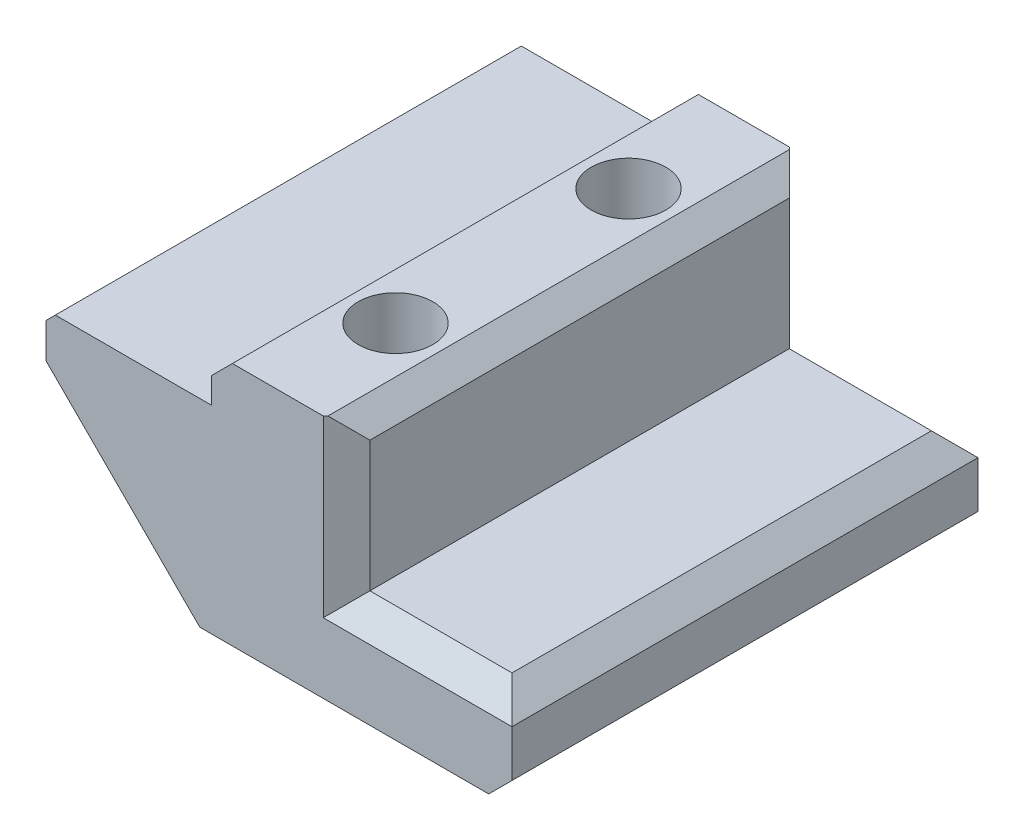
ISO-10303-21;
HEADER;
FILE_DESCRIPTION(('STEP AP214'),'2;1');
FILE_NAME('part.step','',(''),(''),'','','');
FILE_SCHEMA(('AUTOMOTIVE_DESIGN { 1 0 10303 214 1 1 1 1 }'));
ENDSEC;
DATA;
#1=APPLICATION_CONTEXT('core data for automotive mechanical design processes');
#2=APPLICATION_PROTOCOL_DEFINITION('international standard','automotive_design',2000,#1);
#3=PRODUCT_CONTEXT('',#1,'mechanical');
#4=PRODUCT('Part','Part','',(#3));
#5=PRODUCT_RELATED_PRODUCT_CATEGORY('part','',(#4));
#6=PRODUCT_DEFINITION_FORMATION('','',#4);
#7=PRODUCT_DEFINITION_CONTEXT('part definition',#1,'design');
#8=PRODUCT_DEFINITION('design','',#6,#7);
#9=PRODUCT_DEFINITION_SHAPE('','',#8);
#10=(LENGTH_UNIT() NAMED_UNIT(*) SI_UNIT(.MILLI.,.METRE.));
#11=(NAMED_UNIT(*) PLANE_ANGLE_UNIT() SI_UNIT($,.RADIAN.));
#12=(NAMED_UNIT(*) SI_UNIT($,.STERADIAN.) SOLID_ANGLE_UNIT());
#13=UNCERTAINTY_MEASURE_WITH_UNIT(LENGTH_MEASURE(1.E-05),#10,'distance_accuracy_value','');
#14=(GEOMETRIC_REPRESENTATION_CONTEXT(3) GLOBAL_UNCERTAINTY_ASSIGNED_CONTEXT((#13)) GLOBAL_UNIT_ASSIGNED_CONTEXT((#10,
#11,#12)) REPRESENTATION_CONTEXT('',''));
#15=CARTESIAN_POINT('',(0.,0.,0.));
#16=DIRECTION('',(0.,0.,1.));
#17=DIRECTION('',(1.,0.,0.));
#18=AXIS2_PLACEMENT_3D('',#15,#16,#17);
#19=CARTESIAN_POINT('',(10.,8.5,-15.));
#20=DIRECTION('',(0.,-1.,0.));
#21=DIRECTION('',(0.,0.,-1.));
#22=AXIS2_PLACEMENT_3D('',#19,#20,#21);
#23=CYLINDRICAL_SURFACE('',#22,1.6);
#24=CARTESIAN_POINT('',(10.,3.90000000000001,-15.));
#25=DIRECTION('',(0.,-1.,0.));
#26=DIRECTION('',(0.,0.,-1.));
#27=AXIS2_PLACEMENT_3D('',#24,#25,#26);
#28=CIRCLE('',#27,1.6);
#29=CARTESIAN_POINT('',(10.,3.90000000000001,-16.6));
#30=VERTEX_POINT('',#29);
#31=EDGE_CURVE('E196',#30,#30,#28,.T.);
#32=ORIENTED_EDGE('',*,*,#31,.T.);
#33=EDGE_LOOP('',(#32));
#34=FACE_BOUND('',#33,.T.);
#35=CARTESIAN_POINT('',(10.,10.5,-15.));
#36=DIRECTION('',(0.,1.,0.));
#37=DIRECTION('',(0.,0.,1.));
#38=AXIS2_PLACEMENT_3D('',#35,#36,#37);
#39=CIRCLE('',#38,1.6);
#40=CARTESIAN_POINT('',(10.,10.5,-13.4));
#41=VERTEX_POINT('',#40);
#42=EDGE_CURVE('E168',#41,#41,#39,.T.);
#43=ORIENTED_EDGE('',*,*,#42,.T.);
#44=EDGE_LOOP('',(#43));
#45=FACE_BOUND('',#44,.T.);
#46=ADVANCED_FACE('F37',(#34,#45),#23,.F.);
#47=CARTESIAN_POINT('',(10.,8.5,-5.));
#48=DIRECTION('',(0.,-1.,0.));
#49=DIRECTION('',(0.,0.,-1.));
#50=AXIS2_PLACEMENT_3D('',#47,#48,#49);
#51=CYLINDRICAL_SURFACE('',#50,1.6);
#52=CARTESIAN_POINT('',(10.,3.90000000000001,-5.));
#53=DIRECTION('',(0.,-1.,0.));
#54=DIRECTION('',(0.,0.,-1.));
#55=AXIS2_PLACEMENT_3D('',#52,#53,#54);
#56=CIRCLE('',#55,1.6);
#57=CARTESIAN_POINT('',(10.,3.90000000000001,-6.6));
#58=VERTEX_POINT('',#57);
#59=EDGE_CURVE('E199',#58,#58,#56,.T.);
#60=ORIENTED_EDGE('',*,*,#59,.T.);
#61=EDGE_LOOP('',(#60));
#62=FACE_BOUND('',#61,.T.);
#63=CARTESIAN_POINT('',(10.,10.5,-5.));
#64=DIRECTION('',(0.,1.,0.));
#65=DIRECTION('',(0.,0.,1.));
#66=AXIS2_PLACEMENT_3D('',#63,#64,#65);
#67=CIRCLE('',#66,1.6);
#68=CARTESIAN_POINT('',(10.,10.5,-3.4));
#69=VERTEX_POINT('',#68);
#70=EDGE_CURVE('E173',#69,#69,#67,.T.);
#71=ORIENTED_EDGE('',*,*,#70,.T.);
#72=EDGE_LOOP('',(#71));
#73=FACE_BOUND('',#72,.T.);
#74=ADVANCED_FACE('F340',(#62,#73),#51,.F.);
#75=CARTESIAN_POINT('',(0.,4.,0.));
#76=DIRECTION('',(0.,-1.,0.));
#77=DIRECTION('',(0.,0.,-1.));
#78=AXIS2_PLACEMENT_3D('',#75,#76,#77);
#79=PLANE('',#78);
#80=DIRECTION('',(0.,0.,-1.));
#81=VECTOR('',#80,1.);
#82=CARTESIAN_POINT('',(12.9,4.,-20.));
#83=LINE('',#82,#81);
#84=CARTESIAN_POINT('',(12.9,4.,-1.));
#85=VERTEX_POINT('',#84);
#86=CARTESIAN_POINT('',(12.9,4.,-19.));
#87=VERTEX_POINT('',#86);
#88=EDGE_CURVE('E152',#85,#87,#83,.T.);
#89=ORIENTED_EDGE('',*,*,#88,.F.);
#90=DIRECTION('',(1.,0.,0.));
#91=VECTOR('',#90,1.);
#92=CARTESIAN_POINT('',(0.,4.,-1.));
#93=LINE('',#92,#91);
#94=CARTESIAN_POINT('',(19.,4.,-1.));
#95=VERTEX_POINT('',#94);
#96=EDGE_CURVE('E247',#85,#95,#93,.T.);
#97=ORIENTED_EDGE('',*,*,#96,.T.);
#98=DIRECTION('',(0.,0.,-1.));
#99=VECTOR('',#98,1.);
#100=CARTESIAN_POINT('',(19.,4.,0.));
#101=LINE('',#100,#99);
#102=CARTESIAN_POINT('',(19.,4.,-19.));
#103=VERTEX_POINT('',#102);
#104=EDGE_CURVE('E243',#95,#103,#101,.T.);
#105=ORIENTED_EDGE('',*,*,#104,.T.);
#106=DIRECTION('',(-1.,0.,0.));
#107=VECTOR('',#106,1.);
#108=CARTESIAN_POINT('',(0.,4.,-19.));
#109=LINE('',#108,#107);
#110=EDGE_CURVE('E245',#103,#87,#109,.T.);
#111=ORIENTED_EDGE('',*,*,#110,.T.);
#112=EDGE_LOOP('',(#89,#97,#105,#111));
#113=FACE_BOUND('',#112,.T.);
#114=ADVANCED_FACE('F311',(#113),#79,.F.);
#115=CARTESIAN_POINT('',(0.,4.,0.));
#116=DIRECTION('',(1.,0.,0.));
#117=DIRECTION('',(0.,0.,-1.));
#118=AXIS2_PLACEMENT_3D('',#115,#116,#117);
#119=PLANE('',#118);
#120=DIRECTION('',(0.,-1.,0.));
#121=VECTOR('',#120,1.);
#122=CARTESIAN_POINT('',(0.,4.,0.));
#123=LINE('',#122,#121);
#124=CARTESIAN_POINT('',(0.,8.1,0.));
#125=VERTEX_POINT('',#124);
#126=CARTESIAN_POINT('',(0.,6.6,0.));
#127=VERTEX_POINT('',#126);
#128=EDGE_CURVE('E194',#125,#127,#123,.T.);
#129=ORIENTED_EDGE('',*,*,#128,.F.);
#130=DIRECTION('',(0.,0.,-1.));
#131=VECTOR('',#130,1.);
#132=CARTESIAN_POINT('',(0.,8.1,-20.));
#133=LINE('',#132,#131);
#134=CARTESIAN_POINT('',(0.,8.1,-20.));
#135=VERTEX_POINT('',#134);
#136=EDGE_CURVE('E271',#125,#135,#133,.T.);
#137=ORIENTED_EDGE('',*,*,#136,.T.);
#138=DIRECTION('',(0.,-1.,0.));
#139=VECTOR('',#138,1.);
#140=CARTESIAN_POINT('',(0.,4.,-20.));
#141=LINE('',#140,#139);
#142=CARTESIAN_POINT('',(0.,6.6,-20.));
#143=VERTEX_POINT('',#142);
#144=EDGE_CURVE('E186',#135,#143,#141,.T.);
#145=ORIENTED_EDGE('',*,*,#144,.T.);
#146=DIRECTION('',(0.,0.,1.));
#147=VECTOR('',#146,1.);
#148=CARTESIAN_POINT('',(0.,6.6,0.));
#149=LINE('',#148,#147);
#150=EDGE_CURVE('E208',#143,#127,#149,.T.);
#151=ORIENTED_EDGE('',*,*,#150,.T.);
#152=EDGE_LOOP('',(#129,#137,#145,#151));
#153=FACE_BOUND('',#152,.T.);
#154=ADVANCED_FACE('F358',(#153),#119,.F.);
#155=CARTESIAN_POINT('',(0.,4.,0.));
#156=DIRECTION('',(0.,0.,-1.));
#157=DIRECTION('',(-1.,0.,0.));
#158=AXIS2_PLACEMENT_3D('',#155,#156,#157);
#159=PLANE('',#158);
#160=DIRECTION('',(1.,0.,0.));
#161=VECTOR('',#160,1.);
#162=CARTESIAN_POINT('',(7.1,10.5,0.));
#163=LINE('',#162,#161);
#164=CARTESIAN_POINT('',(8.00000000000001,10.5,0.));
#165=VERTEX_POINT('',#164);
#166=CARTESIAN_POINT('',(11.9,10.5,0.));
#167=VERTEX_POINT('',#166);
#168=EDGE_CURVE('E167',#165,#167,#163,.T.);
#169=ORIENTED_EDGE('',*,*,#168,.F.);
#170=DIRECTION('',(-0.707106781186546,-0.707106781186549,0.));
#171=VECTOR('',#170,1.);
#172=CARTESIAN_POINT('',(8.00000000000001,10.5,0.));
#173=LINE('',#172,#171);
#174=CARTESIAN_POINT('',(7.1,9.59999999999999,0.));
#175=VERTEX_POINT('',#174);
#176=EDGE_CURVE('E60',#165,#175,#173,.T.);
#177=ORIENTED_EDGE('',*,*,#176,.T.);
#178=DIRECTION('',(0.,-1.,0.));
#179=VECTOR('',#178,1.);
#180=CARTESIAN_POINT('',(7.1,10.5,0.));
#181=LINE('',#180,#179);
#182=CARTESIAN_POINT('',(7.1,8.5,0.));
#183=VERTEX_POINT('',#182);
#184=EDGE_CURVE('E147',#175,#183,#181,.T.);
#185=ORIENTED_EDGE('',*,*,#184,.T.);
#186=DIRECTION('',(1.,0.,0.));
#187=VECTOR('',#186,1.);
#188=CARTESIAN_POINT('',(0.,8.5,0.));
#189=LINE('',#188,#187);
#190=CARTESIAN_POINT('',(0.399999999999994,8.5,0.));
#191=VERTEX_POINT('',#190);
#192=EDGE_CURVE('E150',#191,#183,#189,.T.);
#193=ORIENTED_EDGE('',*,*,#192,.F.);
#194=DIRECTION('',(-0.707106781186544,-0.707106781186551,0.));
#195=VECTOR('',#194,1.);
#196=CARTESIAN_POINT('',(0.399999999999994,8.5,0.));
#197=LINE('',#196,#195);
#198=EDGE_CURVE('E269',#191,#125,#197,.T.);
#199=ORIENTED_EDGE('',*,*,#198,.T.);
#200=ORIENTED_EDGE('',*,*,#128,.T.);
#201=DIRECTION('',(0.707106781186549,-0.707106781186546,0.));
#202=VECTOR('',#201,1.);
#203=CARTESIAN_POINT('',(0.,6.6,0.));
#204=LINE('',#203,#202);
#205=CARTESIAN_POINT('',(6.60000000000003,0.,0.));
#206=VERTEX_POINT('',#205);
#207=EDGE_CURVE('E211',#127,#206,#204,.T.);
#208=ORIENTED_EDGE('',*,*,#207,.T.);
#209=DIRECTION('',(1.,0.,0.));
#210=VECTOR('',#209,1.);
#211=CARTESIAN_POINT('',(0.,0.,0.));
#212=LINE('',#211,#210);
#213=CARTESIAN_POINT('',(19.,0.,0.));
#214=VERTEX_POINT('',#213);
#215=EDGE_CURVE('E179',#206,#214,#212,.T.);
#216=ORIENTED_EDGE('',*,*,#215,.T.);
#217=DIRECTION('',(0.70710678118655,0.707106781186545,0.));
#218=VECTOR('',#217,1.);
#219=CARTESIAN_POINT('',(20.,0.999999999999997,0.));
#220=LINE('',#219,#218);
#221=CARTESIAN_POINT('',(20.,0.999999999999997,0.));
#222=VERTEX_POINT('',#221);
#223=EDGE_CURVE('E236',#214,#222,#220,.T.);
#224=ORIENTED_EDGE('',*,*,#223,.T.);
#225=DIRECTION('',(0.,-1.,0.));
#226=VECTOR('',#225,1.);
#227=CARTESIAN_POINT('',(20.,4.,0.));
#228=LINE('',#227,#226);
#229=CARTESIAN_POINT('',(20.,2.99999999999999,0.));
#230=VERTEX_POINT('',#229);
#231=EDGE_CURVE('E191',#230,#222,#228,.T.);
#232=ORIENTED_EDGE('',*,*,#231,.F.);
#233=DIRECTION('',(-1.,0.,0.));
#234=VECTOR('',#233,1.);
#235=CARTESIAN_POINT('',(0.,2.99999999999999,0.));
#236=LINE('',#235,#234);
#237=CARTESIAN_POINT('',(11.9,2.99999999999999,0.));
#238=VERTEX_POINT('',#237);
#239=EDGE_CURVE('E238',#230,#238,#236,.T.);
#240=ORIENTED_EDGE('',*,*,#239,.T.);
#241=DIRECTION('',(0.,1.,0.));
#242=VECTOR('',#241,1.);
#243=CARTESIAN_POINT('',(11.9,4.,0.));
#244=LINE('',#243,#242);
#245=EDGE_CURVE('E240',#238,#167,#244,.T.);
#246=ORIENTED_EDGE('',*,*,#245,.T.);
#247=EDGE_LOOP('',(#169,#177,#185,#193,#199,#200,#208,#216,#224,#232,#240,#246));
#248=FACE_BOUND('',#247,.T.);
#249=ADVANCED_FACE('F149',(#248),#159,.F.);
#250=CARTESIAN_POINT('',(20.,4.,0.));
#251=DIRECTION('',(-1.,0.,0.));
#252=DIRECTION('',(0.,0.,1.));
#253=AXIS2_PLACEMENT_3D('',#250,#251,#252);
#254=PLANE('',#253);
#255=DIRECTION('',(0.,-1.,0.));
#256=VECTOR('',#255,1.);
#257=CARTESIAN_POINT('',(20.,4.,-20.));
#258=LINE('',#257,#256);
#259=CARTESIAN_POINT('',(20.,2.99999999999999,-20.));
#260=VERTEX_POINT('',#259);
#261=CARTESIAN_POINT('',(20.,0.999999999999997,-20.));
#262=VERTEX_POINT('',#261);
#263=EDGE_CURVE('E188',#260,#262,#258,.T.);
#264=ORIENTED_EDGE('',*,*,#263,.F.);
#265=DIRECTION('',(0.,0.,1.));
#266=VECTOR('',#265,1.);
#267=CARTESIAN_POINT('',(20.,2.99999999999999,0.));
#268=LINE('',#267,#266);
#269=EDGE_CURVE('E252',#260,#230,#268,.T.);
#270=ORIENTED_EDGE('',*,*,#269,.T.);
#271=ORIENTED_EDGE('',*,*,#231,.T.);
#272=DIRECTION('',(0.,0.,-1.));
#273=VECTOR('',#272,1.);
#274=CARTESIAN_POINT('',(20.,0.999999999999997,-20.));
#275=LINE('',#274,#273);
#276=EDGE_CURVE('E249',#222,#262,#275,.T.);
#277=ORIENTED_EDGE('',*,*,#276,.T.);
#278=EDGE_LOOP('',(#264,#270,#271,#277));
#279=FACE_BOUND('',#278,.T.);
#280=ADVANCED_FACE('F364',(#279),#254,.F.);
#281=CARTESIAN_POINT('',(0.,4.,-20.));
#282=DIRECTION('',(0.,0.,1.));
#283=DIRECTION('',(1.,0.,0.));
#284=AXIS2_PLACEMENT_3D('',#281,#282,#283);
#285=PLANE('',#284);
#286=DIRECTION('',(0.,-1.,0.));
#287=VECTOR('',#286,1.);
#288=CARTESIAN_POINT('',(7.1,10.5,-20.));
#289=LINE('',#288,#287);
#290=CARTESIAN_POINT('',(7.1,9.59999999999999,-20.));
#291=VERTEX_POINT('',#290);
#292=CARTESIAN_POINT('',(7.1,8.5,-20.));
#293=VERTEX_POINT('',#292);
#294=EDGE_CURVE('E153',#291,#293,#289,.T.);
#295=ORIENTED_EDGE('',*,*,#294,.F.);
#296=DIRECTION('',(0.707106781186546,0.707106781186549,0.));
#297=VECTOR('',#296,1.);
#298=CARTESIAN_POINT('',(8.00000000000001,10.5,-20.));
#299=LINE('',#298,#297);
#300=CARTESIAN_POINT('',(8.,10.5,-20.));
#301=VERTEX_POINT('',#300);
#302=EDGE_CURVE('E11',#291,#301,#299,.T.);
#303=ORIENTED_EDGE('',*,*,#302,.T.);
#304=DIRECTION('',(-1.,0.,0.));
#305=VECTOR('',#304,1.);
#306=CARTESIAN_POINT('',(7.1,10.5,-20.));
#307=LINE('',#306,#305);
#308=CARTESIAN_POINT('',(11.9,10.5,-20.));
#309=VERTEX_POINT('',#308);
#310=EDGE_CURVE('E170',#309,#301,#307,.T.);
#311=ORIENTED_EDGE('',*,*,#310,.F.);
#312=DIRECTION('',(0.,-1.,0.));
#313=VECTOR('',#312,1.);
#314=CARTESIAN_POINT('',(11.9,4.,-20.));
#315=LINE('',#314,#313);
#316=CARTESIAN_POINT('',(11.9,2.99999999999999,-20.));
#317=VERTEX_POINT('',#316);
#318=EDGE_CURVE('E223',#309,#317,#315,.T.);
#319=ORIENTED_EDGE('',*,*,#318,.T.);
#320=DIRECTION('',(1.,0.,0.));
#321=VECTOR('',#320,1.);
#322=CARTESIAN_POINT('',(0.,2.99999999999999,-20.));
#323=LINE('',#322,#321);
#324=EDGE_CURVE('E221',#317,#260,#323,.T.);
#325=ORIENTED_EDGE('',*,*,#324,.T.);
#326=ORIENTED_EDGE('',*,*,#263,.T.);
#327=DIRECTION('',(-0.70710678118655,-0.707106781186545,0.));
#328=VECTOR('',#327,1.);
#329=CARTESIAN_POINT('',(20.,0.999999999999997,-20.));
#330=LINE('',#329,#328);
#331=CARTESIAN_POINT('',(19.,0.,-20.));
#332=VERTEX_POINT('',#331);
#333=EDGE_CURVE('E219',#262,#332,#330,.T.);
#334=ORIENTED_EDGE('',*,*,#333,.T.);
#335=DIRECTION('',(-1.,0.,0.));
#336=VECTOR('',#335,1.);
#337=CARTESIAN_POINT('',(0.,0.,-20.));
#338=LINE('',#337,#336);
#339=CARTESIAN_POINT('',(6.60000000000003,0.,-20.));
#340=VERTEX_POINT('',#339);
#341=EDGE_CURVE('E184',#332,#340,#338,.T.);
#342=ORIENTED_EDGE('',*,*,#341,.T.);
#343=DIRECTION('',(-0.707106781186549,0.707106781186546,0.));
#344=VECTOR('',#343,1.);
#345=CARTESIAN_POINT('',(0.,6.6,-20.));
#346=LINE('',#345,#344);
#347=EDGE_CURVE('E216',#340,#143,#346,.T.);
#348=ORIENTED_EDGE('',*,*,#347,.T.);
#349=ORIENTED_EDGE('',*,*,#144,.F.);
#350=DIRECTION('',(0.707106781186544,0.707106781186551,0.));
#351=VECTOR('',#350,1.);
#352=CARTESIAN_POINT('',(0.399999999999994,8.5,-20.));
#353=LINE('',#352,#351);
#354=CARTESIAN_POINT('',(0.399999999999994,8.5,-20.));
#355=VERTEX_POINT('',#354);
#356=EDGE_CURVE('E273',#135,#355,#353,.T.);
#357=ORIENTED_EDGE('',*,*,#356,.T.);
#358=DIRECTION('',(-1.,0.,0.));
#359=VECTOR('',#358,1.);
#360=CARTESIAN_POINT('',(0.,8.5,-20.));
#361=LINE('',#360,#359);
#362=EDGE_CURVE('E164',#293,#355,#361,.T.);
#363=ORIENTED_EDGE('',*,*,#362,.F.);
#364=EDGE_LOOP('',(#295,#303,#311,#319,#325,#326,#334,#342,#348,#349,#357,#363));
#365=FACE_BOUND('',#364,.T.);
#366=ADVANCED_FACE('F328',(#365),#285,.F.);
#367=CARTESIAN_POINT('',(0.,0.,0.));
#368=DIRECTION('',(0.,-1.,0.));
#369=DIRECTION('',(0.,0.,-1.));
#370=AXIS2_PLACEMENT_3D('',#367,#368,#369);
#371=PLANE('',#370);
#372=CARTESIAN_POINT('',(10.,0.,-5.));
#373=DIRECTION('',(0.,-1.,0.));
#374=DIRECTION('',(0.,0.,-1.));
#375=AXIS2_PLACEMENT_3D('',#372,#373,#374);
#376=CIRCLE('',#375,3.);
#377=CARTESIAN_POINT('',(10.,0.,-8.));
#378=VERTEX_POINT('',#377);
#379=EDGE_CURVE('E643',#378,#378,#376,.T.);
#380=ORIENTED_EDGE('',*,*,#379,.F.);
#381=EDGE_LOOP('',(#380));
#382=FACE_BOUND('',#381,.T.);
#383=CARTESIAN_POINT('',(10.,0.,-15.));
#384=DIRECTION('',(0.,-1.,0.));
#385=DIRECTION('',(0.,0.,-1.));
#386=AXIS2_PLACEMENT_3D('',#383,#384,#385);
#387=CIRCLE('',#386,3.);
#388=CARTESIAN_POINT('',(10.,0.,-18.));
#389=VERTEX_POINT('',#388);
#390=EDGE_CURVE('E267',#389,#389,#387,.T.);
#391=ORIENTED_EDGE('',*,*,#390,.F.);
#392=EDGE_LOOP('',(#391));
#393=FACE_BOUND('',#392,.T.);
#394=ORIENTED_EDGE('',*,*,#341,.F.);
#395=DIRECTION('',(0.,0.,1.));
#396=VECTOR('',#395,1.);
#397=CARTESIAN_POINT('',(19.,0.,0.));
#398=LINE('',#397,#396);
#399=EDGE_CURVE('E254',#332,#214,#398,.T.);
#400=ORIENTED_EDGE('',*,*,#399,.T.);
#401=ORIENTED_EDGE('',*,*,#215,.F.);
#402=DIRECTION('',(0.,0.,-1.));
#403=VECTOR('',#402,1.);
#404=CARTESIAN_POINT('',(6.60000000000003,0.,-20.));
#405=LINE('',#404,#403);
#406=EDGE_CURVE('E213',#206,#340,#405,.T.);
#407=ORIENTED_EDGE('',*,*,#406,.T.);
#408=EDGE_LOOP('',(#394,#400,#401,#407));
#409=FACE_BOUND('',#408,.T.);
#410=ADVANCED_FACE('F355',(#382,#393,#409),#371,.T.);
#411=CARTESIAN_POINT('',(12.9,8.5,-20.));
#412=DIRECTION('',(-1.,0.,0.));
#413=DIRECTION('',(0.,0.,1.));
#414=AXIS2_PLACEMENT_3D('',#411,#412,#413);
#415=PLANE('',#414);
#416=DIRECTION('',(0.,1.,0.));
#417=VECTOR('',#416,1.);
#418=CARTESIAN_POINT('',(12.9,8.5,-19.));
#419=LINE('',#418,#417);
#420=CARTESIAN_POINT('',(12.9,9.59999999999999,-19.));
#421=VERTEX_POINT('',#420);
#422=EDGE_CURVE('E228',#87,#421,#419,.T.);
#423=ORIENTED_EDGE('',*,*,#422,.T.);
#424=DIRECTION('',(0.,0.,1.));
#425=VECTOR('',#424,1.);
#426=CARTESIAN_POINT('',(12.9,9.59999999999999,-1.));
#427=LINE('',#426,#425);
#428=CARTESIAN_POINT('',(12.9,9.59999999999999,-1.));
#429=VERTEX_POINT('',#428);
#430=EDGE_CURVE('E283',#421,#429,#427,.T.);
#431=ORIENTED_EDGE('',*,*,#430,.T.);
#432=DIRECTION('',(0.,-1.,0.));
#433=VECTOR('',#432,1.);
#434=CARTESIAN_POINT('',(12.9,8.5,-1.));
#435=LINE('',#434,#433);
#436=EDGE_CURVE('E226',#429,#85,#435,.T.);
#437=ORIENTED_EDGE('',*,*,#436,.T.);
#438=ORIENTED_EDGE('',*,*,#88,.T.);
#439=EDGE_LOOP('',(#423,#431,#437,#438));
#440=FACE_BOUND('',#439,.T.);
#441=ADVANCED_FACE('F308',(#440),#415,.F.);
#442=CARTESIAN_POINT('',(0.,8.5,0.));
#443=DIRECTION('',(0.,1.,0.));
#444=DIRECTION('',(0.,0.,1.));
#445=AXIS2_PLACEMENT_3D('',#442,#443,#444);
#446=PLANE('',#445);
#447=ORIENTED_EDGE('',*,*,#362,.T.);
#448=DIRECTION('',(0.,0.,1.));
#449=VECTOR('',#448,1.);
#450=CARTESIAN_POINT('',(0.399999999999994,8.5,0.));
#451=LINE('',#450,#449);
#452=EDGE_CURVE('E163',#355,#191,#451,.T.);
#453=ORIENTED_EDGE('',*,*,#452,.T.);
#454=ORIENTED_EDGE('',*,*,#192,.T.);
#455=DIRECTION('',(0.,0.,1.));
#456=VECTOR('',#455,1.);
#457=CARTESIAN_POINT('',(7.1,8.5,-20.));
#458=LINE('',#457,#456);
#459=EDGE_CURVE('E160',#293,#183,#458,.T.);
#460=ORIENTED_EDGE('',*,*,#459,.F.);
#461=EDGE_LOOP('',(#447,#453,#454,#460));
#462=FACE_BOUND('',#461,.T.);
#463=ADVANCED_FACE('F159',(#462),#446,.T.);
#464=CARTESIAN_POINT('',(0.,10.5,0.));
#465=DIRECTION('',(0.,1.,0.));
#466=DIRECTION('',(0.,0.,1.));
#467=AXIS2_PLACEMENT_3D('',#464,#465,#466);
#468=PLANE('',#467);
#469=ORIENTED_EDGE('',*,*,#42,.F.);
#470=EDGE_LOOP('',(#469));
#471=FACE_BOUND('',#470,.T.);
#472=DIRECTION('',(-0.70710678118655,0.,0.707106781186545));
#473=VECTOR('',#472,1.);
#474=CARTESIAN_POINT('',(5.94999999999996,10.5,5.95));
#475=LINE('',#474,#473);
#476=CARTESIAN_POINT('',(12.,10.5,-0.100000000000005));
#477=VERTEX_POINT('',#476);
#478=EDGE_CURVE('E231',#167,#477,#475,.F.);
#479=ORIENTED_EDGE('',*,*,#478,.T.);
#480=DIRECTION('',(0.,0.,-1.));
#481=VECTOR('',#480,1.);
#482=CARTESIAN_POINT('',(12.,10.5,-19.));
#483=LINE('',#482,#481);
#484=CARTESIAN_POINT('',(12.,10.5,-19.9));
#485=VERTEX_POINT('',#484);
#486=EDGE_CURVE('E278',#477,#485,#483,.T.);
#487=ORIENTED_EDGE('',*,*,#486,.T.);
#488=DIRECTION('',(0.707106781186545,0.,0.70710678118655));
#489=VECTOR('',#488,1.);
#490=CARTESIAN_POINT('',(15.95,10.5,-15.9499999999999));
#491=LINE('',#490,#489);
#492=EDGE_CURVE('E234',#485,#309,#491,.F.);
#493=ORIENTED_EDGE('',*,*,#492,.T.);
#494=ORIENTED_EDGE('',*,*,#310,.T.);
#495=DIRECTION('',(0.,0.,1.));
#496=VECTOR('',#495,1.);
#497=CARTESIAN_POINT('',(8.00000000000001,10.5,0.));
#498=LINE('',#497,#496);
#499=EDGE_CURVE('E275',#301,#165,#498,.T.);
#500=ORIENTED_EDGE('',*,*,#499,.T.);
#501=ORIENTED_EDGE('',*,*,#168,.T.);
#502=EDGE_LOOP('',(#479,#487,#493,#494,#500,#501));
#503=FACE_BOUND('',#502,.T.);
#504=ORIENTED_EDGE('',*,*,#70,.F.);
#505=EDGE_LOOP('',(#504));
#506=FACE_BOUND('',#505,.T.);
#507=ADVANCED_FACE('F298',(#471,#503,#506),#468,.T.);
#508=CARTESIAN_POINT('',(7.1,10.5,-20.));
#509=DIRECTION('',(1.,0.,0.));
#510=DIRECTION('',(0.,0.,-1.));
#511=AXIS2_PLACEMENT_3D('',#508,#509,#510);
#512=PLANE('',#511);
#513=ORIENTED_EDGE('',*,*,#184,.F.);
#514=DIRECTION('',(0.,0.,-1.));
#515=VECTOR('',#514,1.);
#516=CARTESIAN_POINT('',(7.1,9.59999999999999,-20.));
#517=LINE('',#516,#515);
#518=EDGE_CURVE('E46',#175,#291,#517,.T.);
#519=ORIENTED_EDGE('',*,*,#518,.T.);
#520=ORIENTED_EDGE('',*,*,#294,.T.);
#521=ORIENTED_EDGE('',*,*,#459,.T.);
#522=EDGE_LOOP('',(#513,#519,#520,#521));
#523=FACE_BOUND('',#522,.T.);
#524=ADVANCED_FACE('F166',(#523),#512,.F.);
#525=CARTESIAN_POINT('',(10.,2.4,-5.));
#526=DIRECTION('',(0.,-1.,0.));
#527=DIRECTION('',(0.,0.,-1.));
#528=AXIS2_PLACEMENT_3D('',#525,#526,#527);
#529=CYLINDRICAL_SURFACE('',#528,3.);
#530=CARTESIAN_POINT('',(10.,2.50000000000002,-5.));
#531=DIRECTION('',(0.,-1.,0.));
#532=DIRECTION('',(0.,0.,-1.));
#533=AXIS2_PLACEMENT_3D('',#530,#531,#532);
#534=CIRCLE('',#533,3.);
#535=CARTESIAN_POINT('',(10.,2.50000000000002,-8.));
#536=VERTEX_POINT('',#535);
#537=EDGE_CURVE('E205',#536,#536,#534,.F.);
#538=ORIENTED_EDGE('',*,*,#537,.T.);
#539=EDGE_LOOP('',(#538));
#540=FACE_BOUND('',#539,.T.);
#541=ORIENTED_EDGE('',*,*,#379,.T.);
#542=EDGE_LOOP('',(#541));
#543=FACE_BOUND('',#542,.T.);
#544=ADVANCED_FACE('F491',(#540,#543),#529,.F.);
#545=CARTESIAN_POINT('',(10.,2.4,-15.));
#546=DIRECTION('',(0.,-1.,0.));
#547=DIRECTION('',(0.,0.,-1.));
#548=AXIS2_PLACEMENT_3D('',#545,#546,#547);
#549=CYLINDRICAL_SURFACE('',#548,3.);
#550=CARTESIAN_POINT('',(10.,2.50000000000002,-15.));
#551=DIRECTION('',(0.,-1.,0.));
#552=DIRECTION('',(0.,0.,-1.));
#553=AXIS2_PLACEMENT_3D('',#550,#551,#552);
#554=CIRCLE('',#553,3.);
#555=CARTESIAN_POINT('',(10.,2.50000000000002,-18.));
#556=VERTEX_POINT('',#555);
#557=EDGE_CURVE('E202',#556,#556,#554,.F.);
#558=ORIENTED_EDGE('',*,*,#557,.T.);
#559=EDGE_LOOP('',(#558));
#560=FACE_BOUND('',#559,.T.);
#561=ORIENTED_EDGE('',*,*,#390,.T.);
#562=EDGE_LOOP('',(#561));
#563=FACE_BOUND('',#562,.T.);
#564=ADVANCED_FACE('F381',(#560,#563),#549,.F.);
#565=CARTESIAN_POINT('',(10.,2.4,-15.));
#566=DIRECTION('',(0.,-1.,0.));
#567=DIRECTION('',(0.,0.,-1.));
#568=AXIS2_PLACEMENT_3D('',#565,#566,#567);
#569=CONICAL_SURFACE('',#568,3.10000000000003,0.785398163397453);
#570=ORIENTED_EDGE('',*,*,#31,.F.);
#571=EDGE_LOOP('',(#570));
#572=FACE_BOUND('',#571,.T.);
#573=ORIENTED_EDGE('',*,*,#557,.F.);
#574=EDGE_LOOP('',(#573));
#575=FACE_BOUND('',#574,.T.);
#576=ADVANCED_FACE('F374',(#572,#575),#569,.F.);
#577=CARTESIAN_POINT('',(10.,2.4,-5.));
#578=DIRECTION('',(0.,-1.,0.));
#579=DIRECTION('',(0.,0.,-1.));
#580=AXIS2_PLACEMENT_3D('',#577,#578,#579);
#581=CONICAL_SURFACE('',#580,3.10000000000003,0.785398163397453);
#582=ORIENTED_EDGE('',*,*,#59,.F.);
#583=EDGE_LOOP('',(#582));
#584=FACE_BOUND('',#583,.T.);
#585=ORIENTED_EDGE('',*,*,#537,.F.);
#586=EDGE_LOOP('',(#585));
#587=FACE_BOUND('',#586,.T.);
#588=ADVANCED_FACE('F380',(#584,#587),#581,.F.);
#589=CARTESIAN_POINT('',(0.,6.6,0.));
#590=DIRECTION('',(-0.707106781186546,-0.707106781186549,0.));
#591=DIRECTION('',(0.,0.,-1.));
#592=AXIS2_PLACEMENT_3D('',#589,#590,#591);
#593=PLANE('',#592);
#594=ORIENTED_EDGE('',*,*,#347,.F.);
#595=ORIENTED_EDGE('',*,*,#406,.F.);
#596=ORIENTED_EDGE('',*,*,#207,.F.);
#597=ORIENTED_EDGE('',*,*,#150,.F.);
#598=EDGE_LOOP('',(#594,#595,#596,#597));
#599=FACE_BOUND('',#598,.T.);
#600=ADVANCED_FACE('F388',(#599),#593,.T.);
#601=CARTESIAN_POINT('',(12.9,8.5,-1.));
#602=DIRECTION('',(-0.707106781186545,0.,-0.70710678118655));
#603=DIRECTION('',(0.,-1.,0.));
#604=AXIS2_PLACEMENT_3D('',#601,#602,#603);
#605=PLANE('',#604);
#606=ORIENTED_EDGE('',*,*,#436,.F.);
#607=DIRECTION('',(0.577350269189626,-0.577350269189629,-0.577350269189622));
#608=VECTOR('',#607,1.);
#609=CARTESIAN_POINT('',(13.2666666666667,9.23333333333332,-1.36666666666666));
#610=LINE('',#609,#608);
#611=EDGE_CURVE('E285',#429,#477,#610,.F.);
#612=ORIENTED_EDGE('',*,*,#611,.T.);
#613=ORIENTED_EDGE('',*,*,#478,.F.);
#614=ORIENTED_EDGE('',*,*,#245,.F.);
#615=DIRECTION('',(-0.577350269189627,-0.577350269189627,0.577350269189623));
#616=VECTOR('',#615,1.);
#617=CARTESIAN_POINT('',(14.4,5.50000000000001,-2.5));
#618=LINE('',#617,#616);
#619=EDGE_CURVE('E264',#85,#238,#618,.T.);
#620=ORIENTED_EDGE('',*,*,#619,.F.);
#621=EDGE_LOOP('',(#606,#612,#613,#614,#620));
#622=FACE_BOUND('',#621,.T.);
#623=ADVANCED_FACE('F291',(#622),#605,.F.);
#624=CARTESIAN_POINT('',(0.,4.,-1.));
#625=DIRECTION('',(0.,-0.707106781186545,-0.70710678118655));
#626=DIRECTION('',(1.,0.,0.));
#627=AXIS2_PLACEMENT_3D('',#624,#625,#626);
#628=PLANE('',#627);
#629=ORIENTED_EDGE('',*,*,#619,.T.);
#630=ORIENTED_EDGE('',*,*,#239,.F.);
#631=DIRECTION('',(0.577350269189624,-0.577350269189628,0.577350269189624));
#632=VECTOR('',#631,1.);
#633=CARTESIAN_POINT('',(19.3333333333333,3.66666666666667,-0.666666666666669));
#634=LINE('',#633,#632);
#635=EDGE_CURVE('E261',#95,#230,#634,.T.);
#636=ORIENTED_EDGE('',*,*,#635,.F.);
#637=ORIENTED_EDGE('',*,*,#96,.F.);
#638=EDGE_LOOP('',(#629,#630,#636,#637));
#639=FACE_BOUND('',#638,.T.);
#640=ADVANCED_FACE('F317',(#639),#628,.F.);
#641=CARTESIAN_POINT('',(19.,4.,0.));
#642=DIRECTION('',(-0.70710678118655,-0.707106781186545,0.));
#643=DIRECTION('',(0.,0.,-1.));
#644=AXIS2_PLACEMENT_3D('',#641,#642,#643);
#645=PLANE('',#644);
#646=ORIENTED_EDGE('',*,*,#635,.T.);
#647=ORIENTED_EDGE('',*,*,#269,.F.);
#648=DIRECTION('',(-0.577350269189624,0.577350269189628,0.577350269189624));
#649=VECTOR('',#648,1.);
#650=CARTESIAN_POINT('',(12.6666666666667,10.3333333333333,-12.6666666666667));
#651=LINE('',#650,#649);
#652=EDGE_CURVE('E258',#103,#260,#651,.F.);
#653=ORIENTED_EDGE('',*,*,#652,.F.);
#654=ORIENTED_EDGE('',*,*,#104,.F.);
#655=EDGE_LOOP('',(#646,#647,#653,#654));
#656=FACE_BOUND('',#655,.T.);
#657=ADVANCED_FACE('F322',(#656),#645,.F.);
#658=CARTESIAN_POINT('',(0.,4.,-19.));
#659=DIRECTION('',(0.,-0.707106781186545,0.70710678118655));
#660=DIRECTION('',(-1.,0.,0.));
#661=AXIS2_PLACEMENT_3D('',#658,#659,#660);
#662=PLANE('',#661);
#663=ORIENTED_EDGE('',*,*,#652,.T.);
#664=ORIENTED_EDGE('',*,*,#324,.F.);
#665=DIRECTION('',(0.577350269189622,0.57735026918963,0.577350269189626));
#666=VECTOR('',#665,1.);
#667=CARTESIAN_POINT('',(12.2333333333333,3.33333333333333,-19.6666666666667));
#668=LINE('',#667,#666);
#669=EDGE_CURVE('E256',#87,#317,#668,.F.);
#670=ORIENTED_EDGE('',*,*,#669,.F.);
#671=ORIENTED_EDGE('',*,*,#110,.F.);
#672=EDGE_LOOP('',(#663,#664,#670,#671));
#673=FACE_BOUND('',#672,.T.);
#674=ADVANCED_FACE('F325',(#673),#662,.F.);
#675=CARTESIAN_POINT('',(11.9,4.,-20.));
#676=DIRECTION('',(-0.70710678118655,0.,0.707106781186545));
#677=DIRECTION('',(0.,-1.,0.));
#678=AXIS2_PLACEMENT_3D('',#675,#676,#677);
#679=PLANE('',#678);
#680=ORIENTED_EDGE('',*,*,#492,.F.);
#681=DIRECTION('',(-0.577350269189624,0.577350269189626,-0.577350269189628));
#682=VECTOR('',#681,1.);
#683=CARTESIAN_POINT('',(14.1,8.4,-17.8));
#684=LINE('',#683,#682);
#685=EDGE_CURVE('E281',#485,#421,#684,.F.);
#686=ORIENTED_EDGE('',*,*,#685,.T.);
#687=ORIENTED_EDGE('',*,*,#422,.F.);
#688=ORIENTED_EDGE('',*,*,#669,.T.);
#689=ORIENTED_EDGE('',*,*,#318,.F.);
#690=EDGE_LOOP('',(#680,#686,#687,#688,#689));
#691=FACE_BOUND('',#690,.T.);
#692=ADVANCED_FACE('F304',(#691),#679,.F.);
#693=CARTESIAN_POINT('',(20.,0.999999999999997,0.));
#694=DIRECTION('',(0.707106781186545,-0.70710678118655,0.));
#695=DIRECTION('',(0.,0.,1.));
#696=AXIS2_PLACEMENT_3D('',#693,#694,#695);
#697=PLANE('',#696);
#698=ORIENTED_EDGE('',*,*,#223,.F.);
#699=ORIENTED_EDGE('',*,*,#399,.F.);
#700=ORIENTED_EDGE('',*,*,#333,.F.);
#701=ORIENTED_EDGE('',*,*,#276,.F.);
#702=EDGE_LOOP('',(#698,#699,#700,#701));
#703=FACE_BOUND('',#702,.T.);
#704=ADVANCED_FACE('F403',(#703),#697,.T.);
#705=CARTESIAN_POINT('',(0.399999999999994,8.5,0.));
#706=DIRECTION('',(-0.707106781186551,0.707106781186544,0.));
#707=DIRECTION('',(0.,0.,-1.));
#708=AXIS2_PLACEMENT_3D('',#705,#706,#707);
#709=PLANE('',#708);
#710=ORIENTED_EDGE('',*,*,#356,.F.);
#711=ORIENTED_EDGE('',*,*,#136,.F.);
#712=ORIENTED_EDGE('',*,*,#198,.F.);
#713=ORIENTED_EDGE('',*,*,#452,.F.);
#714=EDGE_LOOP('',(#710,#711,#712,#713));
#715=FACE_BOUND('',#714,.T.);
#716=ADVANCED_FACE('F338',(#715),#709,.T.);
#717=CARTESIAN_POINT('',(12.,10.5,0.));
#718=DIRECTION('',(0.707106781186549,0.707106781186546,0.));
#719=DIRECTION('',(0.,0.,1.));
#720=AXIS2_PLACEMENT_3D('',#717,#718,#719);
#721=PLANE('',#720);
#722=ORIENTED_EDGE('',*,*,#611,.F.);
#723=ORIENTED_EDGE('',*,*,#430,.F.);
#724=ORIENTED_EDGE('',*,*,#685,.F.);
#725=ORIENTED_EDGE('',*,*,#486,.F.);
#726=EDGE_LOOP('',(#722,#723,#724,#725));
#727=FACE_BOUND('',#726,.T.);
#728=ADVANCED_FACE('F301',(#727),#721,.T.);
#729=CARTESIAN_POINT('',(8.00000000000001,10.5,0.));
#730=DIRECTION('',(-0.707106781186549,0.707106781186546,0.));
#731=DIRECTION('',(0.,0.,-1.));
#732=AXIS2_PLACEMENT_3D('',#729,#730,#731);
#733=PLANE('',#732);
#734=ORIENTED_EDGE('',*,*,#302,.F.);
#735=ORIENTED_EDGE('',*,*,#518,.F.);
#736=ORIENTED_EDGE('',*,*,#176,.F.);
#737=ORIENTED_EDGE('',*,*,#499,.F.);
#738=EDGE_LOOP('',(#734,#735,#736,#737));
#739=FACE_BOUND('',#738,.T.);
#740=ADVANCED_FACE('F40',(#739),#733,.T.);
#741=CLOSED_SHELL('',(#46,#74,#114,#154,#249,#280,#366,#410,#441,#463,#507,#524,#544,#564,#576,
#588,#600,#623,#640,#657,#674,#692,#704,#716,#728,#740));
#742=MANIFOLD_SOLID_BREP('B2',#741);
#743=ADVANCED_BREP_SHAPE_REPRESENTATION('',(#18,#742),#14);
#744=SHAPE_DEFINITION_REPRESENTATION(#9,#743);
ENDSEC;
END-ISO-10303-21;
